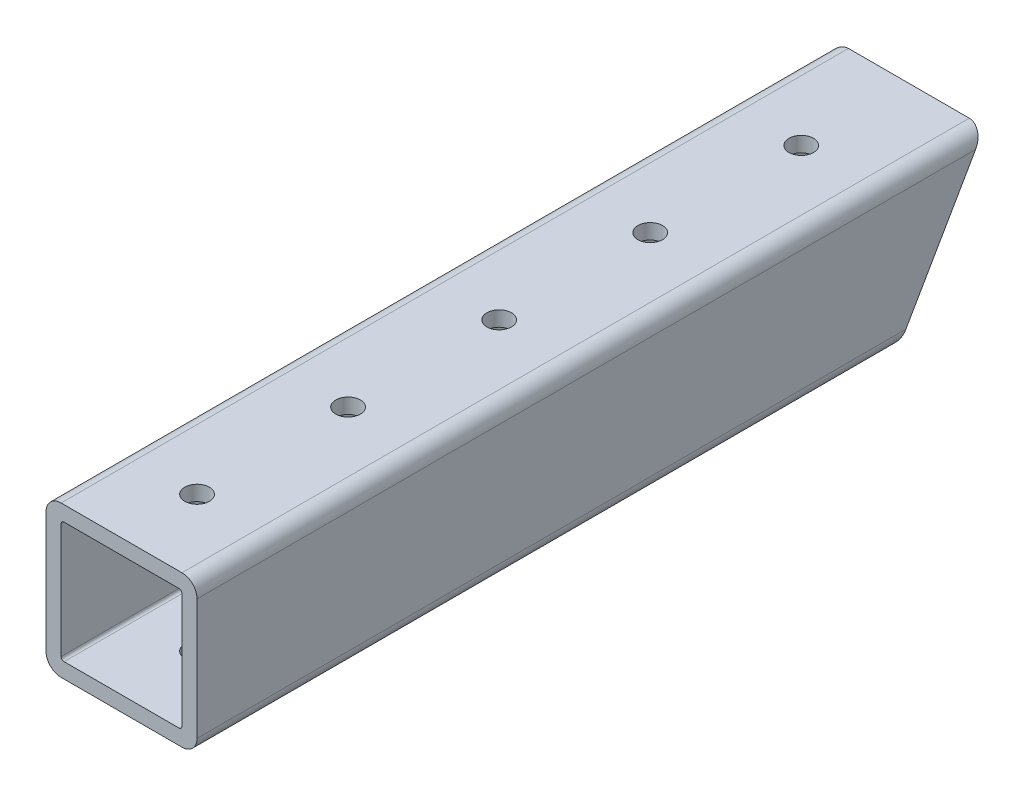
ISO-10303-21;
HEADER;
FILE_DESCRIPTION(('STEP AP214'),'2;1');
FILE_NAME('part.step','',(''),(''),'','','');
FILE_SCHEMA(('AUTOMOTIVE_DESIGN { 1 0 10303 214 1 1 1 1 }'));
ENDSEC;
DATA;
#1=APPLICATION_CONTEXT('core data for automotive mechanical design processes');
#2=APPLICATION_PROTOCOL_DEFINITION('international standard','automotive_design',2000,#1);
#3=PRODUCT_CONTEXT('',#1,'mechanical');
#4=PRODUCT('Part','Part','',(#3));
#5=PRODUCT_RELATED_PRODUCT_CATEGORY('part','',(#4));
#6=PRODUCT_DEFINITION_FORMATION('','',#4);
#7=PRODUCT_DEFINITION_CONTEXT('part definition',#1,'design');
#8=PRODUCT_DEFINITION('design','',#6,#7);
#9=PRODUCT_DEFINITION_SHAPE('','',#8);
#10=(LENGTH_UNIT() NAMED_UNIT(*) SI_UNIT(.MILLI.,.METRE.));
#11=(NAMED_UNIT(*) PLANE_ANGLE_UNIT() SI_UNIT($,.RADIAN.));
#12=(NAMED_UNIT(*) SI_UNIT($,.STERADIAN.) SOLID_ANGLE_UNIT());
#13=UNCERTAINTY_MEASURE_WITH_UNIT(LENGTH_MEASURE(1.E-05),#10,'distance_accuracy_value','');
#14=(GEOMETRIC_REPRESENTATION_CONTEXT(3) GLOBAL_UNCERTAINTY_ASSIGNED_CONTEXT((#13)) GLOBAL_UNIT_ASSIGNED_CONTEXT((#10,
#11,#12)) REPRESENTATION_CONTEXT('',''));
#15=CARTESIAN_POINT('',(0.,0.,0.));
#16=DIRECTION('',(0.,0.,1.));
#17=DIRECTION('',(1.,0.,0.));
#18=AXIS2_PLACEMENT_3D('',#15,#16,#17);
#19=CARTESIAN_POINT('',(-9.65999999999999,9.66,749.3));
#20=DIRECTION('',(0.,0.,1.));
#21=DIRECTION('',(1.,0.,0.));
#22=AXIS2_PLACEMENT_3D('',#19,#20,#21);
#23=CYLINDRICAL_SURFACE('',#22,0.5);
#24=DIRECTION('',(0.,0.,-1.));
#25=VECTOR('',#24,1.);
#26=CARTESIAN_POINT('',(-10.16,9.66,749.3));
#27=LINE('',#26,#25);
#28=CARTESIAN_POINT('',(-10.16,9.66000000000001,618.659281459765));
#29=VERTEX_POINT('',#28);
#30=CARTESIAN_POINT('',(-10.16,9.66,749.3));
#31=VERTEX_POINT('',#30);
#32=EDGE_CURVE('E252',#29,#31,#27,.F.);
#33=ORIENTED_EDGE('',*,*,#32,.F.);
#34=CARTESIAN_POINT('',(-9.65999999999999,9.66,618.659281459765));
#35=DIRECTION('',(0.,0.500000000000004,0.866025403784436));
#36=DIRECTION('',(0.,-0.866025403784436,0.500000000000004));
#37=AXIS2_PLACEMENT_3D('',#34,#35,#36);
#38=ELLIPSE('',#37,0.577350269189628,0.5);
#39=CARTESIAN_POINT('',(-9.65999999999999,10.16,618.370606325171));
#40=VERTEX_POINT('',#39);
#41=EDGE_CURVE('E399',#29,#40,#38,.F.);
#42=ORIENTED_EDGE('',*,*,#41,.T.);
#43=DIRECTION('',(0.,0.,-1.));
#44=VECTOR('',#43,1.);
#45=CARTESIAN_POINT('',(-9.65999999999999,10.16,749.3));
#46=LINE('',#45,#44);
#47=CARTESIAN_POINT('',(-9.65999999999999,10.16,749.3));
#48=VERTEX_POINT('',#47);
#49=EDGE_CURVE('E333',#48,#40,#46,.T.);
#50=ORIENTED_EDGE('',*,*,#49,.F.);
#51=CARTESIAN_POINT('',(-9.65999999999999,9.66,749.3));
#52=DIRECTION('',(0.,0.,1.));
#53=DIRECTION('',(1.,0.,0.));
#54=AXIS2_PLACEMENT_3D('',#51,#52,#53);
#55=CIRCLE('',#54,0.5);
#56=EDGE_CURVE('E391',#31,#48,#55,.F.);
#57=ORIENTED_EDGE('',*,*,#56,.F.);
#58=EDGE_LOOP('',(#33,#42,#50,#57));
#59=FACE_BOUND('',#58,.T.);
#60=ADVANCED_FACE('F41',(#59),#23,.F.);
#61=CARTESIAN_POINT('',(0.,-12.7,635.));
#62=DIRECTION('',(0.,1.,0.));
#63=DIRECTION('',(0.,0.,1.));
#64=AXIS2_PLACEMENT_3D('',#61,#62,#63);
#65=CYLINDRICAL_SURFACE('',#64,2.07009999999996);
#66=CARTESIAN_POINT('',(0.,10.16,635.));
#67=DIRECTION('',(0.,1.,0.));
#68=DIRECTION('',(0.,0.,1.));
#69=AXIS2_PLACEMENT_3D('',#66,#67,#68);
#70=CIRCLE('',#69,2.07009999999996);
#71=CARTESIAN_POINT('',(0.,10.16,637.0701));
#72=VERTEX_POINT('',#71);
#73=EDGE_CURVE('E329',#72,#72,#70,.T.);
#74=ORIENTED_EDGE('',*,*,#73,.F.);
#75=EDGE_LOOP('',(#74));
#76=FACE_BOUND('',#75,.T.);
#77=CARTESIAN_POINT('',(0.,12.7,635.));
#78=DIRECTION('',(0.,1.,0.));
#79=DIRECTION('',(0.,0.,1.));
#80=AXIS2_PLACEMENT_3D('',#77,#78,#79);
#81=CIRCLE('',#80,2.07009999999996);
#82=CARTESIAN_POINT('',(0.,12.7,637.0701));
#83=VERTEX_POINT('',#82);
#84=EDGE_CURVE('E379',#83,#83,#81,.T.);
#85=ORIENTED_EDGE('',*,*,#84,.T.);
#86=EDGE_LOOP('',(#85));
#87=FACE_BOUND('',#86,.T.);
#88=ADVANCED_FACE('F622',(#76,#87),#65,.F.);
#89=CARTESIAN_POINT('',(0.,-12.7,660.4));
#90=DIRECTION('',(0.,1.,0.));
#91=DIRECTION('',(0.,0.,1.));
#92=AXIS2_PLACEMENT_3D('',#89,#90,#91);
#93=CYLINDRICAL_SURFACE('',#92,2.07009999999996);
#94=CARTESIAN_POINT('',(0.,10.16,660.4));
#95=DIRECTION('',(0.,1.,0.));
#96=DIRECTION('',(0.,0.,1.));
#97=AXIS2_PLACEMENT_3D('',#94,#95,#96);
#98=CIRCLE('',#97,2.07009999999996);
#99=CARTESIAN_POINT('',(0.,10.16,662.4701));
#100=VERTEX_POINT('',#99);
#101=EDGE_CURVE('E325',#100,#100,#98,.T.);
#102=ORIENTED_EDGE('',*,*,#101,.F.);
#103=EDGE_LOOP('',(#102));
#104=FACE_BOUND('',#103,.T.);
#105=CARTESIAN_POINT('',(0.,12.7,660.4));
#106=DIRECTION('',(0.,1.,0.));
#107=DIRECTION('',(0.,0.,1.));
#108=AXIS2_PLACEMENT_3D('',#105,#106,#107);
#109=CIRCLE('',#108,2.07009999999996);
#110=CARTESIAN_POINT('',(0.,12.7,662.4701));
#111=VERTEX_POINT('',#110);
#112=EDGE_CURVE('E375',#111,#111,#109,.T.);
#113=ORIENTED_EDGE('',*,*,#112,.T.);
#114=EDGE_LOOP('',(#113));
#115=FACE_BOUND('',#114,.T.);
#116=ADVANCED_FACE('F631',(#104,#115),#93,.F.);
#117=CARTESIAN_POINT('',(0.,-12.7,685.8));
#118=DIRECTION('',(0.,1.,0.));
#119=DIRECTION('',(0.,0.,1.));
#120=AXIS2_PLACEMENT_3D('',#117,#118,#119);
#121=CYLINDRICAL_SURFACE('',#120,2.07009999999996);
#122=CARTESIAN_POINT('',(0.,10.16,685.8));
#123=DIRECTION('',(0.,1.,0.));
#124=DIRECTION('',(0.,0.,1.));
#125=AXIS2_PLACEMENT_3D('',#122,#123,#124);
#126=CIRCLE('',#125,2.07009999999996);
#127=CARTESIAN_POINT('',(0.,10.16,687.8701));
#128=VERTEX_POINT('',#127);
#129=EDGE_CURVE('E321',#128,#128,#126,.T.);
#130=ORIENTED_EDGE('',*,*,#129,.F.);
#131=EDGE_LOOP('',(#130));
#132=FACE_BOUND('',#131,.T.);
#133=CARTESIAN_POINT('',(0.,12.7,685.8));
#134=DIRECTION('',(0.,1.,0.));
#135=DIRECTION('',(0.,0.,1.));
#136=AXIS2_PLACEMENT_3D('',#133,#134,#135);
#137=CIRCLE('',#136,2.07009999999996);
#138=CARTESIAN_POINT('',(0.,12.7,687.8701));
#139=VERTEX_POINT('',#138);
#140=EDGE_CURVE('E371',#139,#139,#137,.T.);
#141=ORIENTED_EDGE('',*,*,#140,.T.);
#142=EDGE_LOOP('',(#141));
#143=FACE_BOUND('',#142,.T.);
#144=ADVANCED_FACE('F639',(#132,#143),#121,.F.);
#145=CARTESIAN_POINT('',(0.,-12.7,711.2));
#146=DIRECTION('',(0.,1.,0.));
#147=DIRECTION('',(0.,0.,1.));
#148=AXIS2_PLACEMENT_3D('',#145,#146,#147);
#149=CYLINDRICAL_SURFACE('',#148,2.07009999999996);
#150=CARTESIAN_POINT('',(0.,10.16,711.2));
#151=DIRECTION('',(0.,1.,0.));
#152=DIRECTION('',(0.,0.,1.));
#153=AXIS2_PLACEMENT_3D('',#150,#151,#152);
#154=CIRCLE('',#153,2.07009999999996);
#155=CARTESIAN_POINT('',(0.,10.16,713.2701));
#156=VERTEX_POINT('',#155);
#157=EDGE_CURVE('E317',#156,#156,#154,.T.);
#158=ORIENTED_EDGE('',*,*,#157,.F.);
#159=EDGE_LOOP('',(#158));
#160=FACE_BOUND('',#159,.T.);
#161=CARTESIAN_POINT('',(0.,12.7,711.2));
#162=DIRECTION('',(0.,1.,0.));
#163=DIRECTION('',(0.,0.,1.));
#164=AXIS2_PLACEMENT_3D('',#161,#162,#163);
#165=CIRCLE('',#164,2.07009999999996);
#166=CARTESIAN_POINT('',(0.,12.7,713.2701));
#167=VERTEX_POINT('',#166);
#168=EDGE_CURVE('E367',#167,#167,#165,.T.);
#169=ORIENTED_EDGE('',*,*,#168,.T.);
#170=EDGE_LOOP('',(#169));
#171=FACE_BOUND('',#170,.T.);
#172=ADVANCED_FACE('F648',(#160,#171),#149,.F.);
#173=CARTESIAN_POINT('',(0.,-12.7,736.6));
#174=DIRECTION('',(0.,1.,0.));
#175=DIRECTION('',(0.,0.,1.));
#176=AXIS2_PLACEMENT_3D('',#173,#174,#175);
#177=CYLINDRICAL_SURFACE('',#176,2.07009999999996);
#178=CARTESIAN_POINT('',(0.,10.16,736.6));
#179=DIRECTION('',(0.,1.,0.));
#180=DIRECTION('',(0.,0.,1.));
#181=AXIS2_PLACEMENT_3D('',#178,#179,#180);
#182=CIRCLE('',#181,2.07009999999996);
#183=CARTESIAN_POINT('',(0.,10.16,738.6701));
#184=VERTEX_POINT('',#183);
#185=EDGE_CURVE('E244',#184,#184,#182,.T.);
#186=ORIENTED_EDGE('',*,*,#185,.F.);
#187=EDGE_LOOP('',(#186));
#188=FACE_BOUND('',#187,.T.);
#189=CARTESIAN_POINT('',(0.,12.7,736.6));
#190=DIRECTION('',(0.,1.,0.));
#191=DIRECTION('',(0.,0.,1.));
#192=AXIS2_PLACEMENT_3D('',#189,#190,#191);
#193=CIRCLE('',#192,2.07009999999996);
#194=CARTESIAN_POINT('',(0.,12.7,738.6701));
#195=VERTEX_POINT('',#194);
#196=EDGE_CURVE('E363',#195,#195,#193,.T.);
#197=ORIENTED_EDGE('',*,*,#196,.T.);
#198=EDGE_LOOP('',(#197));
#199=FACE_BOUND('',#198,.T.);
#200=ADVANCED_FACE('F609',(#188,#199),#177,.F.);
#201=CARTESIAN_POINT('',(9.66,9.65999999999999,749.3));
#202=DIRECTION('',(0.,0.,1.));
#203=DIRECTION('',(1.,0.,0.));
#204=AXIS2_PLACEMENT_3D('',#201,#202,#203);
#205=CYLINDRICAL_SURFACE('',#204,0.5);
#206=DIRECTION('',(0.,0.,-1.));
#207=VECTOR('',#206,1.);
#208=CARTESIAN_POINT('',(9.66,10.16,749.3));
#209=LINE('',#208,#207);
#210=CARTESIAN_POINT('',(9.66,10.16,618.370606325171));
#211=VERTEX_POINT('',#210);
#212=CARTESIAN_POINT('',(9.66,10.16,749.3));
#213=VERTEX_POINT('',#212);
#214=EDGE_CURVE('E251',#211,#213,#209,.F.);
#215=ORIENTED_EDGE('',*,*,#214,.F.);
#216=CARTESIAN_POINT('',(9.66,9.65999999999999,618.659281459765));
#217=DIRECTION('',(0.,0.500000000000004,0.866025403784436));
#218=DIRECTION('',(0.,-0.866025403784436,0.500000000000004));
#219=AXIS2_PLACEMENT_3D('',#216,#217,#218);
#220=ELLIPSE('',#219,0.577350269189628,0.5);
#221=CARTESIAN_POINT('',(10.16,9.66000000000001,618.659281459765));
#222=VERTEX_POINT('',#221);
#223=EDGE_CURVE('E405',#211,#222,#220,.F.);
#224=ORIENTED_EDGE('',*,*,#223,.T.);
#225=DIRECTION('',(0.,0.,1.));
#226=VECTOR('',#225,1.);
#227=CARTESIAN_POINT('',(10.16,9.65999999999999,749.3));
#228=LINE('',#227,#226);
#229=CARTESIAN_POINT('',(10.16,9.65999999999999,749.3));
#230=VERTEX_POINT('',#229);
#231=EDGE_CURVE('E239',#230,#222,#228,.F.);
#232=ORIENTED_EDGE('',*,*,#231,.F.);
#233=CARTESIAN_POINT('',(9.66,9.65999999999999,749.3));
#234=DIRECTION('',(0.,0.,1.));
#235=DIRECTION('',(1.,0.,0.));
#236=AXIS2_PLACEMENT_3D('',#233,#234,#235);
#237=CIRCLE('',#236,0.5);
#238=EDGE_CURVE('E389',#213,#230,#237,.F.);
#239=ORIENTED_EDGE('',*,*,#238,.F.);
#240=EDGE_LOOP('',(#215,#224,#232,#239));
#241=FACE_BOUND('',#240,.T.);
#242=ADVANCED_FACE('F600',(#241),#205,.F.);
#243=CARTESIAN_POINT('',(-9.65999999999999,-9.66,749.3));
#244=DIRECTION('',(0.,0.,1.));
#245=DIRECTION('',(1.,0.,0.));
#246=AXIS2_PLACEMENT_3D('',#243,#244,#245);
#247=CYLINDRICAL_SURFACE('',#246,0.5);
#248=DIRECTION('',(0.,0.,1.));
#249=VECTOR('',#248,1.);
#250=CARTESIAN_POINT('',(-9.65999999999999,-10.16,749.3));
#251=LINE('',#250,#249);
#252=CARTESIAN_POINT('',(-9.65999999999999,-10.16,630.102363795104));
#253=VERTEX_POINT('',#252);
#254=CARTESIAN_POINT('',(-9.65999999999999,-10.16,749.3));
#255=VERTEX_POINT('',#254);
#256=EDGE_CURVE('E247',#253,#255,#251,.T.);
#257=ORIENTED_EDGE('',*,*,#256,.F.);
#258=CARTESIAN_POINT('',(-9.65999999999999,-9.66,629.813688660509));
#259=DIRECTION('',(0.,0.500000000000004,0.866025403784436));
#260=DIRECTION('',(0.,-0.866025403784436,0.500000000000004));
#261=AXIS2_PLACEMENT_3D('',#258,#259,#260);
#262=ELLIPSE('',#261,0.577350269189628,0.5);
#263=CARTESIAN_POINT('',(-10.16,-9.65999999999999,629.813688660509));
#264=VERTEX_POINT('',#263);
#265=EDGE_CURVE('E70',#253,#264,#262,.F.);
#266=ORIENTED_EDGE('',*,*,#265,.T.);
#267=DIRECTION('',(0.,0.,-1.));
#268=VECTOR('',#267,1.);
#269=CARTESIAN_POINT('',(-10.16,-9.66,749.3));
#270=LINE('',#269,#268);
#271=CARTESIAN_POINT('',(-10.16,-9.66,749.3));
#272=VERTEX_POINT('',#271);
#273=EDGE_CURVE('E248',#272,#264,#270,.T.);
#274=ORIENTED_EDGE('',*,*,#273,.F.);
#275=CARTESIAN_POINT('',(-9.65999999999999,-9.66,749.3));
#276=DIRECTION('',(0.,0.,1.));
#277=DIRECTION('',(1.,0.,0.));
#278=AXIS2_PLACEMENT_3D('',#275,#276,#277);
#279=CIRCLE('',#278,0.5);
#280=EDGE_CURVE('E386',#255,#272,#279,.F.);
#281=ORIENTED_EDGE('',*,*,#280,.F.);
#282=EDGE_LOOP('',(#257,#266,#274,#281));
#283=FACE_BOUND('',#282,.T.);
#284=ADVANCED_FACE('F591',(#283),#247,.F.);
#285=CARTESIAN_POINT('',(9.66,-9.66,749.3));
#286=DIRECTION('',(0.,0.,1.));
#287=DIRECTION('',(1.,0.,0.));
#288=AXIS2_PLACEMENT_3D('',#285,#286,#287);
#289=CYLINDRICAL_SURFACE('',#288,0.5);
#290=DIRECTION('',(0.,0.,1.));
#291=VECTOR('',#290,1.);
#292=CARTESIAN_POINT('',(10.16,-9.66,749.3));
#293=LINE('',#292,#291);
#294=CARTESIAN_POINT('',(10.16,-9.65999999999999,629.813688660509));
#295=VERTEX_POINT('',#294);
#296=CARTESIAN_POINT('',(10.16,-9.66,749.3));
#297=VERTEX_POINT('',#296);
#298=EDGE_CURVE('E243',#295,#297,#293,.T.);
#299=ORIENTED_EDGE('',*,*,#298,.F.);
#300=CARTESIAN_POINT('',(9.66,-9.66,629.813688660509));
#301=DIRECTION('',(0.,0.500000000000004,0.866025403784436));
#302=DIRECTION('',(0.,-0.866025403784436,0.500000000000004));
#303=AXIS2_PLACEMENT_3D('',#300,#301,#302);
#304=ELLIPSE('',#303,0.577350269189628,0.5);
#305=CARTESIAN_POINT('',(9.66,-10.16,630.102363795104));
#306=VERTEX_POINT('',#305);
#307=EDGE_CURVE('E418',#295,#306,#304,.F.);
#308=ORIENTED_EDGE('',*,*,#307,.T.);
#309=DIRECTION('',(0.,0.,1.));
#310=VECTOR('',#309,1.);
#311=CARTESIAN_POINT('',(9.66,-10.16,749.3));
#312=LINE('',#311,#310);
#313=CARTESIAN_POINT('',(9.66,-10.16,749.3));
#314=VERTEX_POINT('',#313);
#315=EDGE_CURVE('E309',#314,#306,#312,.F.);
#316=ORIENTED_EDGE('',*,*,#315,.F.);
#317=CARTESIAN_POINT('',(9.66,-9.66,749.3));
#318=DIRECTION('',(0.,0.,1.));
#319=DIRECTION('',(1.,0.,0.));
#320=AXIS2_PLACEMENT_3D('',#317,#318,#319);
#321=CIRCLE('',#320,0.5);
#322=EDGE_CURVE('E383',#297,#314,#321,.F.);
#323=ORIENTED_EDGE('',*,*,#322,.F.);
#324=EDGE_LOOP('',(#299,#308,#316,#323));
#325=FACE_BOUND('',#324,.T.);
#326=ADVANCED_FACE('F584',(#325),#289,.F.);
#327=CARTESIAN_POINT('',(0.,-12.7,635.));
#328=DIRECTION('',(0.,1.,0.));
#329=DIRECTION('',(0.,0.,1.));
#330=AXIS2_PLACEMENT_3D('',#327,#328,#329);
#331=CYLINDRICAL_SURFACE('',#330,2.07009999999996);
#332=CARTESIAN_POINT('',(0.,-10.16,635.));
#333=DIRECTION('',(0.,1.,0.));
#334=DIRECTION('',(0.,0.,1.));
#335=AXIS2_PLACEMENT_3D('',#332,#333,#334);
#336=CIRCLE('',#335,2.07009999999996);
#337=CARTESIAN_POINT('',(0.,-10.16,637.0701));
#338=VERTEX_POINT('',#337);
#339=EDGE_CURVE('E305',#338,#338,#336,.F.);
#340=ORIENTED_EDGE('',*,*,#339,.F.);
#341=EDGE_LOOP('',(#340));
#342=FACE_BOUND('',#341,.T.);
#343=CARTESIAN_POINT('',(0.,-12.7,635.));
#344=DIRECTION('',(0.,1.,0.));
#345=DIRECTION('',(0.,0.,1.));
#346=AXIS2_PLACEMENT_3D('',#343,#344,#345);
#347=CIRCLE('',#346,2.07009999999996);
#348=CARTESIAN_POINT('',(0.,-12.7,637.0701));
#349=VERTEX_POINT('',#348);
#350=EDGE_CURVE('E354',#349,#349,#347,.F.);
#351=ORIENTED_EDGE('',*,*,#350,.T.);
#352=EDGE_LOOP('',(#351));
#353=FACE_BOUND('',#352,.T.);
#354=ADVANCED_FACE('F590',(#342,#353),#331,.F.);
#355=CARTESIAN_POINT('',(0.,-12.7,660.4));
#356=DIRECTION('',(0.,1.,0.));
#357=DIRECTION('',(0.,0.,1.));
#358=AXIS2_PLACEMENT_3D('',#355,#356,#357);
#359=CYLINDRICAL_SURFACE('',#358,2.07009999999996);
#360=CARTESIAN_POINT('',(0.,-10.16,660.4));
#361=DIRECTION('',(0.,1.,0.));
#362=DIRECTION('',(0.,0.,1.));
#363=AXIS2_PLACEMENT_3D('',#360,#361,#362);
#364=CIRCLE('',#363,2.07009999999996);
#365=CARTESIAN_POINT('',(0.,-10.16,662.4701));
#366=VERTEX_POINT('',#365);
#367=EDGE_CURVE('E301',#366,#366,#364,.F.);
#368=ORIENTED_EDGE('',*,*,#367,.F.);
#369=EDGE_LOOP('',(#368));
#370=FACE_BOUND('',#369,.T.);
#371=CARTESIAN_POINT('',(0.,-12.7,660.4));
#372=DIRECTION('',(0.,1.,0.));
#373=DIRECTION('',(0.,0.,1.));
#374=AXIS2_PLACEMENT_3D('',#371,#372,#373);
#375=CIRCLE('',#374,2.07009999999996);
#376=CARTESIAN_POINT('',(0.,-12.7,662.4701));
#377=VERTEX_POINT('',#376);
#378=EDGE_CURVE('E350',#377,#377,#375,.F.);
#379=ORIENTED_EDGE('',*,*,#378,.T.);
#380=EDGE_LOOP('',(#379));
#381=FACE_BOUND('',#380,.T.);
#382=ADVANCED_FACE('F670',(#370,#381),#359,.F.);
#383=CARTESIAN_POINT('',(0.,-12.7,685.8));
#384=DIRECTION('',(0.,1.,0.));
#385=DIRECTION('',(0.,0.,1.));
#386=AXIS2_PLACEMENT_3D('',#383,#384,#385);
#387=CYLINDRICAL_SURFACE('',#386,2.07009999999996);
#388=CARTESIAN_POINT('',(0.,-10.16,685.8));
#389=DIRECTION('',(0.,1.,0.));
#390=DIRECTION('',(0.,0.,1.));
#391=AXIS2_PLACEMENT_3D('',#388,#389,#390);
#392=CIRCLE('',#391,2.07009999999996);
#393=CARTESIAN_POINT('',(0.,-10.16,687.8701));
#394=VERTEX_POINT('',#393);
#395=EDGE_CURVE('E297',#394,#394,#392,.F.);
#396=ORIENTED_EDGE('',*,*,#395,.F.);
#397=EDGE_LOOP('',(#396));
#398=FACE_BOUND('',#397,.T.);
#399=CARTESIAN_POINT('',(0.,-12.7,685.8));
#400=DIRECTION('',(0.,1.,0.));
#401=DIRECTION('',(0.,0.,1.));
#402=AXIS2_PLACEMENT_3D('',#399,#400,#401);
#403=CIRCLE('',#402,2.07009999999996);
#404=CARTESIAN_POINT('',(0.,-12.7,687.8701));
#405=VERTEX_POINT('',#404);
#406=EDGE_CURVE('E346',#405,#405,#403,.F.);
#407=ORIENTED_EDGE('',*,*,#406,.T.);
#408=EDGE_LOOP('',(#407));
#409=FACE_BOUND('',#408,.T.);
#410=ADVANCED_FACE('F679',(#398,#409),#387,.F.);
#411=CARTESIAN_POINT('',(0.,-12.7,711.2));
#412=DIRECTION('',(0.,1.,0.));
#413=DIRECTION('',(0.,0.,1.));
#414=AXIS2_PLACEMENT_3D('',#411,#412,#413);
#415=CYLINDRICAL_SURFACE('',#414,2.07009999999996);
#416=CARTESIAN_POINT('',(0.,-10.16,711.2));
#417=DIRECTION('',(0.,1.,0.));
#418=DIRECTION('',(0.,0.,1.));
#419=AXIS2_PLACEMENT_3D('',#416,#417,#418);
#420=CIRCLE('',#419,2.07009999999996);
#421=CARTESIAN_POINT('',(0.,-10.16,713.2701));
#422=VERTEX_POINT('',#421);
#423=EDGE_CURVE('E293',#422,#422,#420,.F.);
#424=ORIENTED_EDGE('',*,*,#423,.F.);
#425=EDGE_LOOP('',(#424));
#426=FACE_BOUND('',#425,.T.);
#427=CARTESIAN_POINT('',(0.,-12.7,711.2));
#428=DIRECTION('',(0.,1.,0.));
#429=DIRECTION('',(0.,0.,1.));
#430=AXIS2_PLACEMENT_3D('',#427,#428,#429);
#431=CIRCLE('',#430,2.07009999999996);
#432=CARTESIAN_POINT('',(0.,-12.7,713.2701));
#433=VERTEX_POINT('',#432);
#434=EDGE_CURVE('E342',#433,#433,#431,.F.);
#435=ORIENTED_EDGE('',*,*,#434,.T.);
#436=EDGE_LOOP('',(#435));
#437=FACE_BOUND('',#436,.T.);
#438=ADVANCED_FACE('F688',(#426,#437),#415,.F.);
#439=CARTESIAN_POINT('',(0.,-12.7,736.6));
#440=DIRECTION('',(0.,1.,0.));
#441=DIRECTION('',(0.,0.,1.));
#442=AXIS2_PLACEMENT_3D('',#439,#440,#441);
#443=CYLINDRICAL_SURFACE('',#442,2.07009999999996);
#444=CARTESIAN_POINT('',(0.,-10.16,736.6));
#445=DIRECTION('',(0.,1.,0.));
#446=DIRECTION('',(0.,0.,1.));
#447=AXIS2_PLACEMENT_3D('',#444,#445,#446);
#448=CIRCLE('',#447,2.07009999999996);
#449=CARTESIAN_POINT('',(0.,-10.16,738.6701));
#450=VERTEX_POINT('',#449);
#451=EDGE_CURVE('E289',#450,#450,#448,.F.);
#452=ORIENTED_EDGE('',*,*,#451,.F.);
#453=EDGE_LOOP('',(#452));
#454=FACE_BOUND('',#453,.T.);
#455=CARTESIAN_POINT('',(0.,-12.7,736.6));
#456=DIRECTION('',(0.,1.,0.));
#457=DIRECTION('',(0.,0.,1.));
#458=AXIS2_PLACEMENT_3D('',#455,#456,#457);
#459=CIRCLE('',#458,2.07009999999996);
#460=CARTESIAN_POINT('',(0.,-12.7,738.6701));
#461=VERTEX_POINT('',#460);
#462=EDGE_CURVE('E255',#461,#461,#459,.F.);
#463=ORIENTED_EDGE('',*,*,#462,.T.);
#464=EDGE_LOOP('',(#463));
#465=FACE_BOUND('',#464,.T.);
#466=ADVANCED_FACE('F697',(#454,#465),#443,.F.);
#467=CARTESIAN_POINT('',(-10.16,12.7,749.3));
#468=DIRECTION('',(0.,-1.,0.));
#469=DIRECTION('',(0.,0.,-1.));
#470=AXIS2_PLACEMENT_3D('',#467,#468,#469);
#471=PLANE('',#470);
#472=ORIENTED_EDGE('',*,*,#196,.F.);
#473=EDGE_LOOP('',(#472));
#474=FACE_BOUND('',#473,.T.);
#475=ORIENTED_EDGE('',*,*,#168,.F.);
#476=EDGE_LOOP('',(#475));
#477=FACE_BOUND('',#476,.T.);
#478=ORIENTED_EDGE('',*,*,#140,.F.);
#479=EDGE_LOOP('',(#478));
#480=FACE_BOUND('',#479,.T.);
#481=ORIENTED_EDGE('',*,*,#112,.F.);
#482=EDGE_LOOP('',(#481));
#483=FACE_BOUND('',#482,.T.);
#484=ORIENTED_EDGE('',*,*,#84,.F.);
#485=EDGE_LOOP('',(#484));
#486=FACE_BOUND('',#485,.T.);
#487=DIRECTION('',(0.,0.,-1.));
#488=VECTOR('',#487,1.);
#489=CARTESIAN_POINT('',(10.16,12.7,749.3));
#490=LINE('',#489,#488);
#491=CARTESIAN_POINT('',(10.16,12.7,616.904136641429));
#492=VERTEX_POINT('',#491);
#493=CARTESIAN_POINT('',(10.16,12.7,749.3));
#494=VERTEX_POINT('',#493);
#495=EDGE_CURVE('E219',#492,#494,#490,.F.);
#496=ORIENTED_EDGE('',*,*,#495,.F.);
#497=DIRECTION('',(-1.,0.,0.));
#498=VECTOR('',#497,1.);
#499=CARTESIAN_POINT('',(-10.16,12.7,616.904136641429));
#500=LINE('',#499,#498);
#501=CARTESIAN_POINT('',(-10.16,12.7,616.904136641429));
#502=VERTEX_POINT('',#501);
#503=EDGE_CURVE('E426',#492,#502,#500,.T.);
#504=ORIENTED_EDGE('',*,*,#503,.T.);
#505=DIRECTION('',(0.,0.,-1.));
#506=VECTOR('',#505,1.);
#507=CARTESIAN_POINT('',(-10.16,12.7,749.3));
#508=LINE('',#507,#506);
#509=CARTESIAN_POINT('',(-10.16,12.7,749.3));
#510=VERTEX_POINT('',#509);
#511=EDGE_CURVE('E262',#510,#502,#508,.T.);
#512=ORIENTED_EDGE('',*,*,#511,.F.);
#513=DIRECTION('',(1.,0.,0.));
#514=VECTOR('',#513,1.);
#515=CARTESIAN_POINT('',(10.16,12.7,749.3));
#516=LINE('',#515,#514);
#517=EDGE_CURVE('E282',#494,#510,#516,.F.);
#518=ORIENTED_EDGE('',*,*,#517,.F.);
#519=EDGE_LOOP('',(#496,#504,#512,#518));
#520=FACE_BOUND('',#519,.T.);
#521=ADVANCED_FACE('F515',(#474,#477,#480,#483,#486,#520),#471,.F.);
#522=CARTESIAN_POINT('',(-10.16,10.16,749.3));
#523=DIRECTION('',(0.,0.,-1.));
#524=DIRECTION('',(-1.,0.,0.));
#525=AXIS2_PLACEMENT_3D('',#522,#523,#524);
#526=CYLINDRICAL_SURFACE('',#525,2.54);
#527=CARTESIAN_POINT('',(-10.16,10.16,618.370606325171));
#528=DIRECTION('',(0.,0.500000000000004,0.866025403784436));
#529=DIRECTION('',(0.,0.866025403784436,-0.500000000000004));
#530=AXIS2_PLACEMENT_3D('',#527,#528,#529);
#531=ELLIPSE('',#530,2.93293936748331,2.54);
#532=CARTESIAN_POINT('',(-12.7,10.16,618.37060632517));
#533=VERTEX_POINT('',#532);
#534=EDGE_CURVE('E429',#533,#502,#531,.F.);
#535=ORIENTED_EDGE('',*,*,#534,.F.);
#536=DIRECTION('',(0.,0.,-1.));
#537=VECTOR('',#536,1.);
#538=CARTESIAN_POINT('',(-12.7,10.16,749.3));
#539=LINE('',#538,#537);
#540=CARTESIAN_POINT('',(-12.7,10.16,749.3));
#541=VERTEX_POINT('',#540);
#542=EDGE_CURVE('E261',#533,#541,#539,.F.);
#543=ORIENTED_EDGE('',*,*,#542,.T.);
#544=CARTESIAN_POINT('',(-10.16,10.16,749.3));
#545=DIRECTION('',(0.,0.,-1.));
#546=DIRECTION('',(-1.,0.,0.));
#547=AXIS2_PLACEMENT_3D('',#544,#545,#546);
#548=CIRCLE('',#547,2.54);
#549=EDGE_CURVE('E238',#510,#541,#548,.F.);
#550=ORIENTED_EDGE('',*,*,#549,.F.);
#551=ORIENTED_EDGE('',*,*,#511,.T.);
#552=EDGE_LOOP('',(#535,#543,#550,#551));
#553=FACE_BOUND('',#552,.T.);
#554=ADVANCED_FACE('F512',(#553),#526,.T.);
#555=CARTESIAN_POINT('',(-12.7,-10.16,749.3));
#556=DIRECTION('',(1.,0.,0.));
#557=DIRECTION('',(0.,0.,-1.));
#558=AXIS2_PLACEMENT_3D('',#555,#556,#557);
#559=PLANE('',#558);
#560=ORIENTED_EDGE('',*,*,#542,.F.);
#561=DIRECTION('',(0.,-0.866025403784436,0.500000000000004));
#562=VECTOR('',#561,1.);
#563=CARTESIAN_POINT('',(-12.7,-61.7740905122481,659.901772846328));
#564=LINE('',#563,#562);
#565=CARTESIAN_POINT('',(-12.7,-10.16,630.102363795104));
#566=VERTEX_POINT('',#565);
#567=EDGE_CURVE('E432',#533,#566,#564,.T.);
#568=ORIENTED_EDGE('',*,*,#567,.T.);
#569=DIRECTION('',(0.,0.,-1.));
#570=VECTOR('',#569,1.);
#571=CARTESIAN_POINT('',(-12.7,-10.16,749.3));
#572=LINE('',#571,#570);
#573=CARTESIAN_POINT('',(-12.7,-10.16,749.3));
#574=VERTEX_POINT('',#573);
#575=EDGE_CURVE('E256',#574,#566,#572,.T.);
#576=ORIENTED_EDGE('',*,*,#575,.F.);
#577=DIRECTION('',(0.,1.,0.));
#578=VECTOR('',#577,1.);
#579=CARTESIAN_POINT('',(-12.7,-10.16,749.3));
#580=LINE('',#579,#578);
#581=EDGE_CURVE('E234',#541,#574,#580,.F.);
#582=ORIENTED_EDGE('',*,*,#581,.F.);
#583=EDGE_LOOP('',(#560,#568,#576,#582));
#584=FACE_BOUND('',#583,.T.);
#585=ADVANCED_FACE('F514',(#584),#559,.F.);
#586=CARTESIAN_POINT('',(-10.16,-10.16,749.3));
#587=DIRECTION('',(0.,0.,-1.));
#588=DIRECTION('',(-1.,0.,0.));
#589=AXIS2_PLACEMENT_3D('',#586,#587,#588);
#590=CYLINDRICAL_SURFACE('',#589,2.54);
#591=CARTESIAN_POINT('',(-10.16,-10.16,630.102363795104));
#592=DIRECTION('',(0.,0.500000000000004,0.866025403784436));
#593=DIRECTION('',(0.,0.866025403784436,-0.500000000000004));
#594=AXIS2_PLACEMENT_3D('',#591,#592,#593);
#595=ELLIPSE('',#594,2.93293936748331,2.54);
#596=CARTESIAN_POINT('',(-10.16,-12.7,631.568833478846));
#597=VERTEX_POINT('',#596);
#598=EDGE_CURVE('E436',#597,#566,#595,.F.);
#599=ORIENTED_EDGE('',*,*,#598,.F.);
#600=DIRECTION('',(0.,0.,-1.));
#601=VECTOR('',#600,1.);
#602=CARTESIAN_POINT('',(-10.16,-12.7,749.3));
#603=LINE('',#602,#601);
#604=CARTESIAN_POINT('',(-10.16,-12.7,749.3));
#605=VERTEX_POINT('',#604);
#606=EDGE_CURVE('E260',#597,#605,#603,.F.);
#607=ORIENTED_EDGE('',*,*,#606,.T.);
#608=CARTESIAN_POINT('',(-10.16,-10.16,749.3));
#609=DIRECTION('',(0.,0.,-1.));
#610=DIRECTION('',(-1.,0.,0.));
#611=AXIS2_PLACEMENT_3D('',#608,#609,#610);
#612=CIRCLE('',#611,2.54);
#613=EDGE_CURVE('E237',#574,#605,#612,.F.);
#614=ORIENTED_EDGE('',*,*,#613,.F.);
#615=ORIENTED_EDGE('',*,*,#575,.T.);
#616=EDGE_LOOP('',(#599,#607,#614,#615));
#617=FACE_BOUND('',#616,.T.);
#618=ADVANCED_FACE('F530',(#617),#590,.T.);
#619=CARTESIAN_POINT('',(-10.16,-12.7,749.3));
#620=DIRECTION('',(0.,1.,0.));
#621=DIRECTION('',(0.,0.,1.));
#622=AXIS2_PLACEMENT_3D('',#619,#620,#621);
#623=PLANE('',#622);
#624=ORIENTED_EDGE('',*,*,#462,.F.);
#625=EDGE_LOOP('',(#624));
#626=FACE_BOUND('',#625,.T.);
#627=ORIENTED_EDGE('',*,*,#434,.F.);
#628=EDGE_LOOP('',(#627));
#629=FACE_BOUND('',#628,.T.);
#630=ORIENTED_EDGE('',*,*,#406,.F.);
#631=EDGE_LOOP('',(#630));
#632=FACE_BOUND('',#631,.T.);
#633=ORIENTED_EDGE('',*,*,#378,.F.);
#634=EDGE_LOOP('',(#633));
#635=FACE_BOUND('',#634,.T.);
#636=ORIENTED_EDGE('',*,*,#350,.F.);
#637=EDGE_LOOP('',(#636));
#638=FACE_BOUND('',#637,.T.);
#639=ORIENTED_EDGE('',*,*,#606,.F.);
#640=DIRECTION('',(1.,0.,0.));
#641=VECTOR('',#640,1.);
#642=CARTESIAN_POINT('',(-10.16,-12.7,631.568833478846));
#643=LINE('',#642,#641);
#644=CARTESIAN_POINT('',(10.16,-12.7,631.568833478846));
#645=VERTEX_POINT('',#644);
#646=EDGE_CURVE('E204',#597,#645,#643,.T.);
#647=ORIENTED_EDGE('',*,*,#646,.T.);
#648=DIRECTION('',(0.,0.,-1.));
#649=VECTOR('',#648,1.);
#650=CARTESIAN_POINT('',(10.16,-12.7,749.3));
#651=LINE('',#650,#649);
#652=CARTESIAN_POINT('',(10.16,-12.7,749.3));
#653=VERTEX_POINT('',#652);
#654=EDGE_CURVE('E202',#653,#645,#651,.T.);
#655=ORIENTED_EDGE('',*,*,#654,.F.);
#656=DIRECTION('',(1.,0.,0.));
#657=VECTOR('',#656,1.);
#658=CARTESIAN_POINT('',(10.16,-12.7,749.3));
#659=LINE('',#658,#657);
#660=EDGE_CURVE('E272',#605,#653,#659,.T.);
#661=ORIENTED_EDGE('',*,*,#660,.F.);
#662=EDGE_LOOP('',(#639,#647,#655,#661));
#663=FACE_BOUND('',#662,.T.);
#664=ADVANCED_FACE('F537',(#626,#629,#632,#635,#638,#663),#623,.F.);
#665=CARTESIAN_POINT('',(-10.16,-10.16,749.3));
#666=DIRECTION('',(1.,0.,0.));
#667=DIRECTION('',(0.,0.,-1.));
#668=AXIS2_PLACEMENT_3D('',#665,#666,#667);
#669=PLANE('',#668);
#670=DIRECTION('',(0.,-0.866025403784436,0.500000000000004));
#671=VECTOR('',#670,1.);
#672=CARTESIAN_POINT('',(-10.16,-61.7740905122481,659.901772846328));
#673=LINE('',#672,#671);
#674=EDGE_CURVE('E59',#29,#264,#673,.T.);
#675=ORIENTED_EDGE('',*,*,#674,.F.);
#676=ORIENTED_EDGE('',*,*,#32,.T.);
#677=DIRECTION('',(0.,1.,0.));
#678=VECTOR('',#677,1.);
#679=CARTESIAN_POINT('',(-10.16,-10.16,749.3));
#680=LINE('',#679,#678);
#681=EDGE_CURVE('E224',#272,#31,#680,.T.);
#682=ORIENTED_EDGE('',*,*,#681,.F.);
#683=ORIENTED_EDGE('',*,*,#273,.T.);
#684=EDGE_LOOP('',(#675,#676,#682,#683));
#685=FACE_BOUND('',#684,.T.);
#686=ADVANCED_FACE('F546',(#685),#669,.T.);
#687=CARTESIAN_POINT('',(-10.16,10.16,749.3));
#688=DIRECTION('',(0.,-1.,0.));
#689=DIRECTION('',(0.,0.,-1.));
#690=AXIS2_PLACEMENT_3D('',#687,#688,#689);
#691=PLANE('',#690);
#692=DIRECTION('',(-1.,0.,0.));
#693=VECTOR('',#692,1.);
#694=CARTESIAN_POINT('',(-10.16,10.16,618.370606325171));
#695=LINE('',#694,#693);
#696=EDGE_CURVE('E393',#211,#40,#695,.T.);
#697=ORIENTED_EDGE('',*,*,#696,.F.);
#698=ORIENTED_EDGE('',*,*,#214,.T.);
#699=DIRECTION('',(1.,0.,0.));
#700=VECTOR('',#699,1.);
#701=CARTESIAN_POINT('',(10.16,10.16,749.3));
#702=LINE('',#701,#700);
#703=EDGE_CURVE('E233',#48,#213,#702,.T.);
#704=ORIENTED_EDGE('',*,*,#703,.F.);
#705=ORIENTED_EDGE('',*,*,#49,.T.);
#706=EDGE_LOOP('',(#697,#698,#704,#705));
#707=FACE_BOUND('',#706,.T.);
#708=ORIENTED_EDGE('',*,*,#185,.T.);
#709=EDGE_LOOP('',(#708));
#710=FACE_BOUND('',#709,.T.);
#711=ORIENTED_EDGE('',*,*,#157,.T.);
#712=EDGE_LOOP('',(#711));
#713=FACE_BOUND('',#712,.T.);
#714=ORIENTED_EDGE('',*,*,#129,.T.);
#715=EDGE_LOOP('',(#714));
#716=FACE_BOUND('',#715,.T.);
#717=ORIENTED_EDGE('',*,*,#101,.T.);
#718=EDGE_LOOP('',(#717));
#719=FACE_BOUND('',#718,.T.);
#720=ORIENTED_EDGE('',*,*,#73,.T.);
#721=EDGE_LOOP('',(#720));
#722=FACE_BOUND('',#721,.T.);
#723=ADVANCED_FACE('F553',(#707,#710,#713,#716,#719,#722),#691,.T.);
#724=CARTESIAN_POINT('',(10.16,-10.16,749.3));
#725=DIRECTION('',(-1.,0.,0.));
#726=DIRECTION('',(0.,0.,1.));
#727=AXIS2_PLACEMENT_3D('',#724,#725,#726);
#728=PLANE('',#727);
#729=DIRECTION('',(0.,0.866025403784436,-0.500000000000004));
#730=VECTOR('',#729,1.);
#731=CARTESIAN_POINT('',(10.16,-61.7740905122481,659.901772846328));
#732=LINE('',#731,#730);
#733=EDGE_CURVE('E412',#295,#222,#732,.T.);
#734=ORIENTED_EDGE('',*,*,#733,.F.);
#735=ORIENTED_EDGE('',*,*,#298,.T.);
#736=DIRECTION('',(0.,1.,0.));
#737=VECTOR('',#736,1.);
#738=CARTESIAN_POINT('',(10.16,-10.16,749.3));
#739=LINE('',#738,#737);
#740=EDGE_CURVE('E229',#230,#297,#739,.F.);
#741=ORIENTED_EDGE('',*,*,#740,.F.);
#742=ORIENTED_EDGE('',*,*,#231,.T.);
#743=EDGE_LOOP('',(#734,#735,#741,#742));
#744=FACE_BOUND('',#743,.T.);
#745=ADVANCED_FACE('F501',(#744),#728,.T.);
#746=CARTESIAN_POINT('',(-10.16,-10.16,749.3));
#747=DIRECTION('',(0.,1.,0.));
#748=DIRECTION('',(0.,0.,1.));
#749=AXIS2_PLACEMENT_3D('',#746,#747,#748);
#750=PLANE('',#749);
#751=DIRECTION('',(1.,0.,0.));
#752=VECTOR('',#751,1.);
#753=CARTESIAN_POINT('',(-10.16,-10.16,630.102363795104));
#754=LINE('',#753,#752);
#755=EDGE_CURVE('E422',#253,#306,#754,.T.);
#756=ORIENTED_EDGE('',*,*,#755,.F.);
#757=ORIENTED_EDGE('',*,*,#256,.T.);
#758=DIRECTION('',(1.,0.,0.));
#759=VECTOR('',#758,1.);
#760=CARTESIAN_POINT('',(10.16,-10.16,749.3));
#761=LINE('',#760,#759);
#762=EDGE_CURVE('E228',#314,#255,#761,.F.);
#763=ORIENTED_EDGE('',*,*,#762,.F.);
#764=ORIENTED_EDGE('',*,*,#315,.T.);
#765=EDGE_LOOP('',(#756,#757,#763,#764));
#766=FACE_BOUND('',#765,.T.);
#767=ORIENTED_EDGE('',*,*,#451,.T.);
#768=EDGE_LOOP('',(#767));
#769=FACE_BOUND('',#768,.T.);
#770=ORIENTED_EDGE('',*,*,#423,.T.);
#771=EDGE_LOOP('',(#770));
#772=FACE_BOUND('',#771,.T.);
#773=ORIENTED_EDGE('',*,*,#395,.T.);
#774=EDGE_LOOP('',(#773));
#775=FACE_BOUND('',#774,.T.);
#776=ORIENTED_EDGE('',*,*,#367,.T.);
#777=EDGE_LOOP('',(#776));
#778=FACE_BOUND('',#777,.T.);
#779=ORIENTED_EDGE('',*,*,#339,.T.);
#780=EDGE_LOOP('',(#779));
#781=FACE_BOUND('',#780,.T.);
#782=ADVANCED_FACE('F505',(#766,#769,#772,#775,#778,#781),#750,.T.);
#783=CARTESIAN_POINT('',(10.16,-10.16,749.3));
#784=DIRECTION('',(0.,0.,-1.));
#785=DIRECTION('',(-1.,0.,0.));
#786=AXIS2_PLACEMENT_3D('',#783,#784,#785);
#787=CYLINDRICAL_SURFACE('',#786,2.54);
#788=CARTESIAN_POINT('',(10.16,-10.16,630.102363795104));
#789=DIRECTION('',(0.,0.500000000000004,0.866025403784436));
#790=DIRECTION('',(0.,0.866025403784436,-0.500000000000004));
#791=AXIS2_PLACEMENT_3D('',#788,#789,#790);
#792=ELLIPSE('',#791,2.93293936748331,2.54);
#793=CARTESIAN_POINT('',(12.7,-10.16,630.102363795104));
#794=VERTEX_POINT('',#793);
#795=EDGE_CURVE('E188',#794,#645,#792,.F.);
#796=ORIENTED_EDGE('',*,*,#795,.F.);
#797=DIRECTION('',(0.,0.,1.));
#798=VECTOR('',#797,1.);
#799=CARTESIAN_POINT('',(12.7,-10.16,749.3));
#800=LINE('',#799,#798);
#801=CARTESIAN_POINT('',(12.7,-10.16,749.3));
#802=VERTEX_POINT('',#801);
#803=EDGE_CURVE('E200',#794,#802,#800,.T.);
#804=ORIENTED_EDGE('',*,*,#803,.T.);
#805=CARTESIAN_POINT('',(10.16,-10.16,749.3));
#806=DIRECTION('',(0.,0.,-1.));
#807=DIRECTION('',(-1.,0.,0.));
#808=AXIS2_PLACEMENT_3D('',#805,#806,#807);
#809=CIRCLE('',#808,2.54);
#810=EDGE_CURVE('E285',#653,#802,#809,.F.);
#811=ORIENTED_EDGE('',*,*,#810,.F.);
#812=ORIENTED_EDGE('',*,*,#654,.T.);
#813=EDGE_LOOP('',(#796,#804,#811,#812));
#814=FACE_BOUND('',#813,.T.);
#815=ADVANCED_FACE('F198',(#814),#787,.T.);
#816=CARTESIAN_POINT('',(10.16,-10.16,749.3));
#817=DIRECTION('',(0.,0.,1.));
#818=DIRECTION('',(1.,0.,0.));
#819=AXIS2_PLACEMENT_3D('',#816,#817,#818);
#820=PLANE('',#819);
#821=ORIENTED_EDGE('',*,*,#681,.T.);
#822=ORIENTED_EDGE('',*,*,#56,.T.);
#823=ORIENTED_EDGE('',*,*,#703,.T.);
#824=ORIENTED_EDGE('',*,*,#238,.T.);
#825=ORIENTED_EDGE('',*,*,#740,.T.);
#826=ORIENTED_EDGE('',*,*,#322,.T.);
#827=ORIENTED_EDGE('',*,*,#762,.T.);
#828=ORIENTED_EDGE('',*,*,#280,.T.);
#829=EDGE_LOOP('',(#821,#822,#823,#824,#825,#826,#827,#828));
#830=FACE_BOUND('',#829,.T.);
#831=ORIENTED_EDGE('',*,*,#613,.T.);
#832=ORIENTED_EDGE('',*,*,#660,.T.);
#833=ORIENTED_EDGE('',*,*,#810,.T.);
#834=DIRECTION('',(0.,1.,0.));
#835=VECTOR('',#834,1.);
#836=CARTESIAN_POINT('',(12.7,-10.16,749.3));
#837=LINE('',#836,#835);
#838=CARTESIAN_POINT('',(12.7,10.16,749.3));
#839=VERTEX_POINT('',#838);
#840=EDGE_CURVE('E209',#802,#839,#837,.T.);
#841=ORIENTED_EDGE('',*,*,#840,.T.);
#842=CARTESIAN_POINT('',(10.16,10.16,749.3));
#843=DIRECTION('',(0.,0.,-1.));
#844=DIRECTION('',(-1.,0.,0.));
#845=AXIS2_PLACEMENT_3D('',#842,#843,#844);
#846=CIRCLE('',#845,2.54);
#847=EDGE_CURVE('E211',#494,#839,#846,.T.);
#848=ORIENTED_EDGE('',*,*,#847,.F.);
#849=ORIENTED_EDGE('',*,*,#517,.T.);
#850=ORIENTED_EDGE('',*,*,#549,.T.);
#851=ORIENTED_EDGE('',*,*,#581,.T.);
#852=EDGE_LOOP('',(#831,#832,#833,#841,#848,#849,#850,#851));
#853=FACE_BOUND('',#852,.T.);
#854=ADVANCED_FACE('F456',(#830,#853),#820,.T.);
#855=CARTESIAN_POINT('',(10.16,10.16,749.3));
#856=DIRECTION('',(0.,0.,-1.));
#857=DIRECTION('',(-1.,0.,0.));
#858=AXIS2_PLACEMENT_3D('',#855,#856,#857);
#859=CYLINDRICAL_SURFACE('',#858,2.54);
#860=CARTESIAN_POINT('',(10.16,10.16,618.370606325171));
#861=DIRECTION('',(0.,0.500000000000004,0.866025403784436));
#862=DIRECTION('',(0.,0.866025403784436,-0.500000000000004));
#863=AXIS2_PLACEMENT_3D('',#860,#861,#862);
#864=ELLIPSE('',#863,2.93293936748331,2.54);
#865=CARTESIAN_POINT('',(12.7,10.16,618.370606325171));
#866=VERTEX_POINT('',#865);
#867=EDGE_CURVE('E191',#492,#866,#864,.F.);
#868=ORIENTED_EDGE('',*,*,#867,.F.);
#869=ORIENTED_EDGE('',*,*,#495,.T.);
#870=ORIENTED_EDGE('',*,*,#847,.T.);
#871=DIRECTION('',(0.,0.,1.));
#872=VECTOR('',#871,1.);
#873=CARTESIAN_POINT('',(12.7,10.16,749.3));
#874=LINE('',#873,#872);
#875=EDGE_CURVE('E49',#839,#866,#874,.F.);
#876=ORIENTED_EDGE('',*,*,#875,.T.);
#877=EDGE_LOOP('',(#868,#869,#870,#876));
#878=FACE_BOUND('',#877,.T.);
#879=ADVANCED_FACE('F461',(#878),#859,.T.);
#880=CARTESIAN_POINT('',(12.7,-10.16,749.3));
#881=DIRECTION('',(-1.,0.,0.));
#882=DIRECTION('',(0.,0.,1.));
#883=AXIS2_PLACEMENT_3D('',#880,#881,#882);
#884=PLANE('',#883);
#885=ORIENTED_EDGE('',*,*,#803,.F.);
#886=DIRECTION('',(0.,0.866025403784436,-0.500000000000004));
#887=VECTOR('',#886,1.);
#888=CARTESIAN_POINT('',(12.7,-61.7740905122481,659.901772846328));
#889=LINE('',#888,#887);
#890=EDGE_CURVE('E12',#794,#866,#889,.T.);
#891=ORIENTED_EDGE('',*,*,#890,.T.);
#892=ORIENTED_EDGE('',*,*,#875,.F.);
#893=ORIENTED_EDGE('',*,*,#840,.F.);
#894=EDGE_LOOP('',(#885,#891,#892,#893));
#895=FACE_BOUND('',#894,.T.);
#896=ADVANCED_FACE('F207',(#895),#884,.F.);
#897=CARTESIAN_POINT('',(0.,270.302327015593,468.177363795101));
#898=DIRECTION('',(0.,0.500000000000004,0.866025403784436));
#899=DIRECTION('',(0.,-0.866025403784436,0.500000000000004));
#900=AXIS2_PLACEMENT_3D('',#897,#898,#899);
#901=PLANE('',#900);
#902=ORIENTED_EDGE('',*,*,#223,.F.);
#903=ORIENTED_EDGE('',*,*,#696,.T.);
#904=ORIENTED_EDGE('',*,*,#41,.F.);
#905=ORIENTED_EDGE('',*,*,#674,.T.);
#906=ORIENTED_EDGE('',*,*,#265,.F.);
#907=ORIENTED_EDGE('',*,*,#755,.T.);
#908=ORIENTED_EDGE('',*,*,#307,.F.);
#909=ORIENTED_EDGE('',*,*,#733,.T.);
#910=EDGE_LOOP('',(#902,#903,#904,#905,#906,#907,#908,#909));
#911=FACE_BOUND('',#910,.T.);
#912=ORIENTED_EDGE('',*,*,#503,.F.);
#913=ORIENTED_EDGE('',*,*,#867,.T.);
#914=ORIENTED_EDGE('',*,*,#890,.F.);
#915=ORIENTED_EDGE('',*,*,#795,.T.);
#916=ORIENTED_EDGE('',*,*,#646,.F.);
#917=ORIENTED_EDGE('',*,*,#598,.T.);
#918=ORIENTED_EDGE('',*,*,#567,.F.);
#919=ORIENTED_EDGE('',*,*,#534,.T.);
#920=EDGE_LOOP('',(#912,#913,#914,#915,#916,#917,#918,#919));
#921=FACE_BOUND('',#920,.T.);
#922=ADVANCED_FACE('F187',(#911,#921),#901,.F.);
#923=CLOSED_SHELL('',(#60,#88,#116,#144,#172,#200,#242,#284,#326,#354,#382,#410,#438,#466,#521,
#554,#585,#618,#664,#686,#723,#745,#782,#815,#854,#879,#896,#922));
#924=MANIFOLD_SOLID_BREP('B2',#923);
#925=ADVANCED_BREP_SHAPE_REPRESENTATION('',(#18,#924),#14);
#926=SHAPE_DEFINITION_REPRESENTATION(#9,#925);
ENDSEC;
END-ISO-10303-21;
